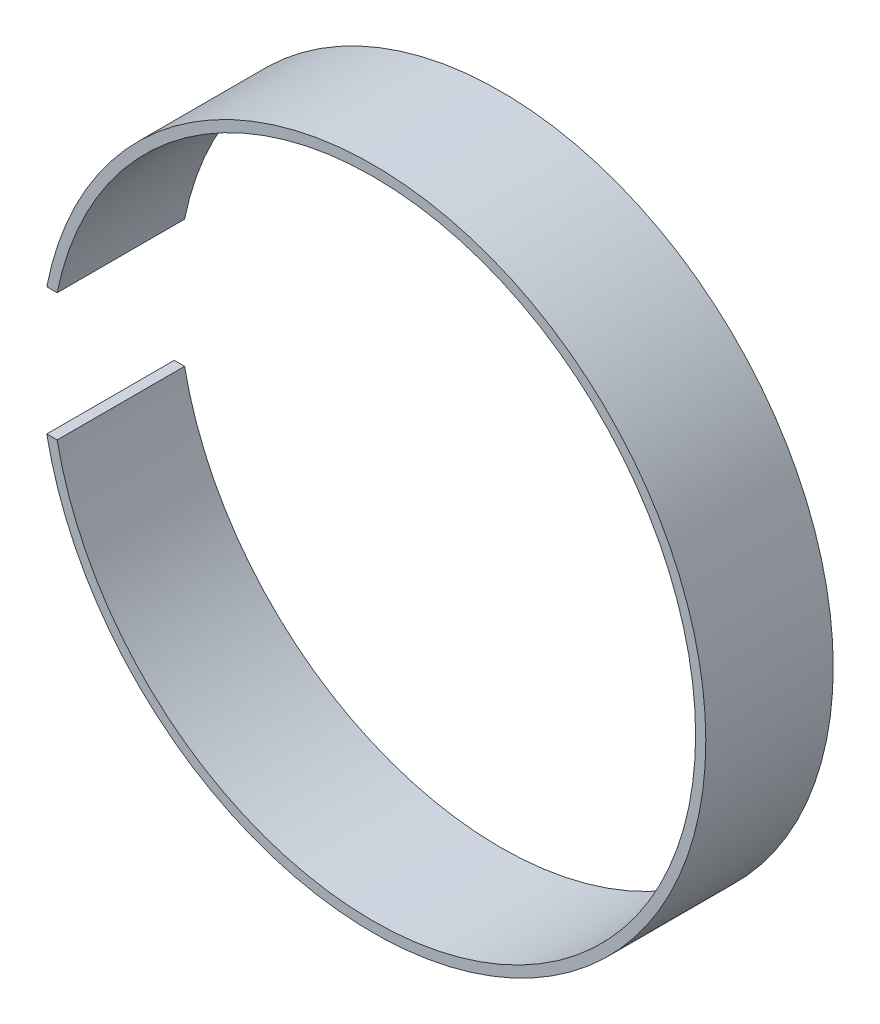
ISO-10303-21;
HEADER;
FILE_DESCRIPTION(('STEP AP214'),'2;1');
FILE_NAME('part.step','',(''),(''),'','','');
FILE_SCHEMA(('AUTOMOTIVE_DESIGN { 1 0 10303 214 1 1 1 1 }'));
ENDSEC;
DATA;
#1=APPLICATION_CONTEXT('core data for automotive mechanical design processes');
#2=APPLICATION_PROTOCOL_DEFINITION('international standard','automotive_design',2000,#1);
#3=PRODUCT_CONTEXT('',#1,'mechanical');
#4=PRODUCT('Part','Part','',(#3));
#5=PRODUCT_RELATED_PRODUCT_CATEGORY('part','',(#4));
#6=PRODUCT_DEFINITION_FORMATION('','',#4);
#7=PRODUCT_DEFINITION_CONTEXT('part definition',#1,'design');
#8=PRODUCT_DEFINITION('design','',#6,#7);
#9=PRODUCT_DEFINITION_SHAPE('','',#8);
#10=(LENGTH_UNIT() NAMED_UNIT(*) SI_UNIT(.MILLI.,.METRE.));
#11=(NAMED_UNIT(*) PLANE_ANGLE_UNIT() SI_UNIT($,.RADIAN.));
#12=(NAMED_UNIT(*) SI_UNIT($,.STERADIAN.) SOLID_ANGLE_UNIT());
#13=UNCERTAINTY_MEASURE_WITH_UNIT(LENGTH_MEASURE(1.E-05),#10,'distance_accuracy_value','');
#14=(GEOMETRIC_REPRESENTATION_CONTEXT(3) GLOBAL_UNCERTAINTY_ASSIGNED_CONTEXT((#13)) GLOBAL_UNIT_ASSIGNED_CONTEXT((#10,
#11,#12)) REPRESENTATION_CONTEXT('',''));
#15=CARTESIAN_POINT('',(0.,0.,0.));
#16=DIRECTION('',(0.,0.,1.));
#17=DIRECTION('',(1.,0.,0.));
#18=AXIS2_PLACEMENT_3D('',#15,#16,#17);
#19=CARTESIAN_POINT('',(0.,0.,250.));
#20=DIRECTION('',(0.,0.,-1.));
#21=DIRECTION('',(-1.,0.,0.));
#22=AXIS2_PLACEMENT_3D('',#19,#20,#21);
#23=CYLINDRICAL_SURFACE('',#22,652.5);
#24=CARTESIAN_POINT('',(0.,0.,0.));
#25=DIRECTION('',(0.,0.,1.));
#26=DIRECTION('',(1.,0.,0.));
#27=AXIS2_PLACEMENT_3D('',#24,#25,#26);
#28=CIRCLE('',#27,652.5);
#29=CARTESIAN_POINT('',(-640.41490457359,-125.,0.));
#30=VERTEX_POINT('',#29);
#31=CARTESIAN_POINT('',(-640.41490457359,125.,0.));
#32=VERTEX_POINT('',#31);
#33=EDGE_CURVE('E96',#30,#32,#28,.T.);
#34=ORIENTED_EDGE('',*,*,#33,.T.);
#35=DIRECTION('',(0.,0.,-1.));
#36=VECTOR('',#35,1.);
#37=CARTESIAN_POINT('',(-640.41490457359,125.,250.));
#38=LINE('',#37,#36);
#39=CARTESIAN_POINT('',(-640.41490457359,125.,250.));
#40=VERTEX_POINT('',#39);
#41=EDGE_CURVE('E11',#40,#32,#38,.T.);
#42=ORIENTED_EDGE('',*,*,#41,.F.);
#43=CARTESIAN_POINT('',(0.,0.,250.));
#44=DIRECTION('',(0.,0.,1.));
#45=DIRECTION('',(1.,0.,0.));
#46=AXIS2_PLACEMENT_3D('',#43,#44,#45);
#47=CIRCLE('',#46,652.5);
#48=CARTESIAN_POINT('',(-640.41490457359,-125.,250.));
#49=VERTEX_POINT('',#48);
#50=EDGE_CURVE('E84',#49,#40,#47,.T.);
#51=ORIENTED_EDGE('',*,*,#50,.F.);
#52=DIRECTION('',(0.,0.,-1.));
#53=VECTOR('',#52,1.);
#54=CARTESIAN_POINT('',(-640.41490457359,-125.,250.));
#55=LINE('',#54,#53);
#56=EDGE_CURVE('E92',#49,#30,#55,.T.);
#57=ORIENTED_EDGE('',*,*,#56,.T.);
#58=EDGE_LOOP('',(#34,#42,#51,#57));
#59=FACE_BOUND('',#58,.T.);
#60=ADVANCED_FACE('F33',(#59),#23,.T.);
#61=CARTESIAN_POINT('',(-640.41490457359,125.,250.));
#62=DIRECTION('',(0.,1.,0.));
#63=DIRECTION('',(0.,0.,1.));
#64=AXIS2_PLACEMENT_3D('',#61,#62,#63);
#65=PLANE('',#64);
#66=DIRECTION('',(1.,0.,0.));
#67=VECTOR('',#66,1.);
#68=CARTESIAN_POINT('',(-640.41490457359,125.,0.));
#69=LINE('',#68,#67);
#70=CARTESIAN_POINT('',(-620.025201100729,125.,0.));
#71=VERTEX_POINT('',#70);
#72=EDGE_CURVE('E88',#32,#71,#69,.T.);
#73=ORIENTED_EDGE('',*,*,#72,.T.);
#74=DIRECTION('',(0.,0.,-1.));
#75=VECTOR('',#74,1.);
#76=CARTESIAN_POINT('',(-620.025201100729,125.,250.));
#77=LINE('',#76,#75);
#78=CARTESIAN_POINT('',(-620.025201100729,125.,250.));
#79=VERTEX_POINT('',#78);
#80=EDGE_CURVE('E41',#79,#71,#77,.T.);
#81=ORIENTED_EDGE('',*,*,#80,.F.);
#82=DIRECTION('',(1.,0.,0.));
#83=VECTOR('',#82,1.);
#84=CARTESIAN_POINT('',(-640.41490457359,125.,250.));
#85=LINE('',#84,#83);
#86=EDGE_CURVE('E79',#40,#79,#85,.T.);
#87=ORIENTED_EDGE('',*,*,#86,.F.);
#88=ORIENTED_EDGE('',*,*,#41,.T.);
#89=EDGE_LOOP('',(#73,#81,#87,#88));
#90=FACE_BOUND('',#89,.T.);
#91=ADVANCED_FACE('F87',(#90),#65,.F.);
#92=CARTESIAN_POINT('',(0.,0.,250.));
#93=DIRECTION('',(0.,0.,-1.));
#94=DIRECTION('',(-1.,0.,0.));
#95=AXIS2_PLACEMENT_3D('',#92,#93,#94);
#96=CYLINDRICAL_SURFACE('',#95,632.5);
#97=CARTESIAN_POINT('',(0.,0.,0.));
#98=DIRECTION('',(0.,0.,-1.));
#99=DIRECTION('',(1.,0.,0.));
#100=AXIS2_PLACEMENT_3D('',#97,#98,#99);
#101=CIRCLE('',#100,632.5);
#102=CARTESIAN_POINT('',(-620.025201100729,-125.,0.));
#103=VERTEX_POINT('',#102);
#104=EDGE_CURVE('E66',#71,#103,#101,.T.);
#105=ORIENTED_EDGE('',*,*,#104,.T.);
#106=DIRECTION('',(0.,0.,-1.));
#107=VECTOR('',#106,1.);
#108=CARTESIAN_POINT('',(-620.025201100729,-125.,250.));
#109=LINE('',#108,#107);
#110=CARTESIAN_POINT('',(-620.025201100729,-125.,250.));
#111=VERTEX_POINT('',#110);
#112=EDGE_CURVE('E89',#111,#103,#109,.T.);
#113=ORIENTED_EDGE('',*,*,#112,.F.);
#114=CARTESIAN_POINT('',(0.,0.,250.));
#115=DIRECTION('',(0.,0.,-1.));
#116=DIRECTION('',(1.,0.,0.));
#117=AXIS2_PLACEMENT_3D('',#114,#115,#116);
#118=CIRCLE('',#117,632.5);
#119=EDGE_CURVE('E82',#79,#111,#118,.T.);
#120=ORIENTED_EDGE('',*,*,#119,.F.);
#121=ORIENTED_EDGE('',*,*,#80,.T.);
#122=EDGE_LOOP('',(#105,#113,#120,#121));
#123=FACE_BOUND('',#122,.T.);
#124=ADVANCED_FACE('F90',(#123),#96,.F.);
#125=CARTESIAN_POINT('',(-640.41490457359,-125.,250.));
#126=DIRECTION('',(0.,-1.,0.));
#127=DIRECTION('',(0.,0.,-1.));
#128=AXIS2_PLACEMENT_3D('',#125,#126,#127);
#129=PLANE('',#128);
#130=DIRECTION('',(-1.,0.,0.));
#131=VECTOR('',#130,1.);
#132=CARTESIAN_POINT('',(-640.41490457359,-125.,0.));
#133=LINE('',#132,#131);
#134=EDGE_CURVE('E72',#103,#30,#133,.T.);
#135=ORIENTED_EDGE('',*,*,#134,.T.);
#136=ORIENTED_EDGE('',*,*,#56,.F.);
#137=DIRECTION('',(-1.,0.,0.));
#138=VECTOR('',#137,1.);
#139=CARTESIAN_POINT('',(-640.41490457359,-125.,250.));
#140=LINE('',#139,#138);
#141=EDGE_CURVE('E49',#111,#49,#140,.T.);
#142=ORIENTED_EDGE('',*,*,#141,.F.);
#143=ORIENTED_EDGE('',*,*,#112,.T.);
#144=EDGE_LOOP('',(#135,#136,#142,#143));
#145=FACE_BOUND('',#144,.T.);
#146=ADVANCED_FACE('F103',(#145),#129,.F.);
#147=CARTESIAN_POINT('',(0.,0.,250.));
#148=DIRECTION('',(0.,0.,1.));
#149=DIRECTION('',(1.,0.,0.));
#150=AXIS2_PLACEMENT_3D('',#147,#148,#149);
#151=PLANE('',#150);
#152=ORIENTED_EDGE('',*,*,#50,.T.);
#153=ORIENTED_EDGE('',*,*,#86,.T.);
#154=ORIENTED_EDGE('',*,*,#119,.T.);
#155=ORIENTED_EDGE('',*,*,#141,.T.);
#156=EDGE_LOOP('',(#152,#153,#154,#155));
#157=FACE_BOUND('',#156,.T.);
#158=ADVANCED_FACE('F80',(#157),#151,.T.);
#159=CARTESIAN_POINT('',(0.,0.,0.));
#160=DIRECTION('',(0.,0.,1.));
#161=DIRECTION('',(1.,0.,0.));
#162=AXIS2_PLACEMENT_3D('',#159,#160,#161);
#163=PLANE('',#162);
#164=ORIENTED_EDGE('',*,*,#33,.F.);
#165=ORIENTED_EDGE('',*,*,#134,.F.);
#166=ORIENTED_EDGE('',*,*,#104,.F.);
#167=ORIENTED_EDGE('',*,*,#72,.F.);
#168=EDGE_LOOP('',(#164,#165,#166,#167));
#169=FACE_BOUND('',#168,.T.);
#170=ADVANCED_FACE('F106',(#169),#163,.F.);
#171=CLOSED_SHELL('',(#60,#91,#124,#146,#158,#170));
#172=MANIFOLD_SOLID_BREP('B2',#171);
#173=ADVANCED_BREP_SHAPE_REPRESENTATION('',(#18,#172),#14);
#174=SHAPE_DEFINITION_REPRESENTATION(#9,#173);
ENDSEC;
END-ISO-10303-21;
